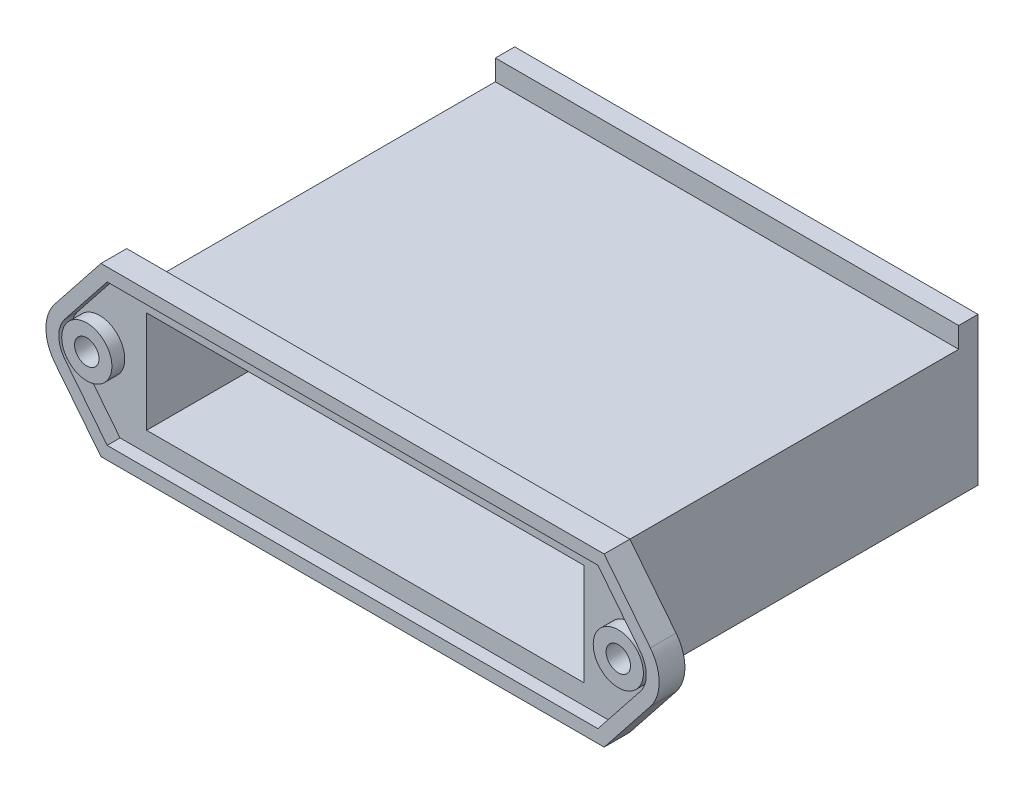
ISO-10303-21;
HEADER;
FILE_DESCRIPTION(('STEP AP214'),'2;1');
FILE_NAME('part.step','',(''),(''),'','','');
FILE_SCHEMA(('AUTOMOTIVE_DESIGN { 1 0 10303 214 1 1 1 1 }'));
ENDSEC;
DATA;
#1=APPLICATION_CONTEXT('core data for automotive mechanical design processes');
#2=APPLICATION_PROTOCOL_DEFINITION('international standard','automotive_design',2000,#1);
#3=PRODUCT_CONTEXT('',#1,'mechanical');
#4=PRODUCT('Part','Part','',(#3));
#5=PRODUCT_RELATED_PRODUCT_CATEGORY('part','',(#4));
#6=PRODUCT_DEFINITION_FORMATION('','',#4);
#7=PRODUCT_DEFINITION_CONTEXT('part definition',#1,'design');
#8=PRODUCT_DEFINITION('design','',#6,#7);
#9=PRODUCT_DEFINITION_SHAPE('','',#8);
#10=(LENGTH_UNIT() NAMED_UNIT(*) SI_UNIT(.MILLI.,.METRE.));
#11=(NAMED_UNIT(*) PLANE_ANGLE_UNIT() SI_UNIT($,.RADIAN.));
#12=(NAMED_UNIT(*) SI_UNIT($,.STERADIAN.) SOLID_ANGLE_UNIT());
#13=UNCERTAINTY_MEASURE_WITH_UNIT(LENGTH_MEASURE(1.E-05),#10,'distance_accuracy_value','');
#14=(GEOMETRIC_REPRESENTATION_CONTEXT(3) GLOBAL_UNCERTAINTY_ASSIGNED_CONTEXT((#13)) GLOBAL_UNIT_ASSIGNED_CONTEXT((#10,
#11,#12)) REPRESENTATION_CONTEXT('',''));
#15=CARTESIAN_POINT('',(0.,0.,0.));
#16=DIRECTION('',(0.,0.,1.));
#17=DIRECTION('',(1.,0.,0.));
#18=AXIS2_PLACEMENT_3D('',#15,#16,#17);
#19=CARTESIAN_POINT('',(41.3,0.,32.6));
#20=DIRECTION('',(0.,0.,-1.));
#21=DIRECTION('',(-1.,0.,0.));
#22=AXIS2_PLACEMENT_3D('',#19,#20,#21);
#23=PLANE('',#22);
#24=CARTESIAN_POINT('',(-41.3,0.,32.6));
#25=DIRECTION('',(0.,0.,1.));
#26=DIRECTION('',(1.,0.,0.));
#27=AXIS2_PLACEMENT_3D('',#24,#25,#26);
#28=CIRCLE('',#27,1.9);
#29=CARTESIAN_POINT('',(-39.4,0.,32.6));
#30=VERTEX_POINT('',#29);
#31=EDGE_CURVE('E335',#30,#30,#28,.T.);
#32=ORIENTED_EDGE('',*,*,#31,.F.);
#33=EDGE_LOOP('',(#32));
#34=FACE_BOUND('',#33,.T.);
#35=CARTESIAN_POINT('',(-41.3,0.,32.6));
#36=DIRECTION('',(0.,0.,-1.));
#37=DIRECTION('',(-1.,0.,0.));
#38=AXIS2_PLACEMENT_3D('',#35,#36,#37);
#39=CIRCLE('',#38,3.9);
#40=CARTESIAN_POINT('',(-45.2,0.,32.6));
#41=VERTEX_POINT('',#40);
#42=EDGE_CURVE('E244',#41,#41,#39,.F.);
#43=ORIENTED_EDGE('',*,*,#42,.T.);
#44=EDGE_LOOP('',(#43));
#45=FACE_BOUND('',#44,.T.);
#46=ADVANCED_FACE('F33',(#34,#45),#23,.F.);
#47=CARTESIAN_POINT('',(41.3,0.,32.6));
#48=DIRECTION('',(0.,0.,1.));
#49=DIRECTION('',(1.,0.,0.));
#50=AXIS2_PLACEMENT_3D('',#47,#48,#49);
#51=CIRCLE('',#50,1.9);
#52=CARTESIAN_POINT('',(43.2,0.,32.6));
#53=VERTEX_POINT('',#52);
#54=EDGE_CURVE('E329',#53,#53,#51,.T.);
#55=ORIENTED_EDGE('',*,*,#54,.F.);
#56=EDGE_LOOP('',(#55));
#57=FACE_BOUND('',#56,.T.);
#58=CARTESIAN_POINT('',(41.3,0.,32.6));
#59=DIRECTION('',(0.,0.,-1.));
#60=DIRECTION('',(-1.,0.,0.));
#61=AXIS2_PLACEMENT_3D('',#58,#59,#60);
#62=CIRCLE('',#61,3.9);
#63=CARTESIAN_POINT('',(37.4,0.,32.6));
#64=VERTEX_POINT('',#63);
#65=EDGE_CURVE('E245',#64,#64,#62,.F.);
#66=ORIENTED_EDGE('',*,*,#65,.T.);
#67=EDGE_LOOP('',(#66));
#68=FACE_BOUND('',#67,.T.);
#69=ADVANCED_FACE('F456',(#57,#68),#23,.F.);
#70=CARTESIAN_POINT('',(-36.,9.9,-28.6));
#71=DIRECTION('',(1.,0.,0.));
#72=DIRECTION('',(0.,0.,-1.));
#73=AXIS2_PLACEMENT_3D('',#70,#71,#72);
#74=PLANE('',#73);
#75=DIRECTION('',(0.,0.,1.));
#76=VECTOR('',#75,1.);
#77=CARTESIAN_POINT('',(-36.,9.9,-28.6));
#78=LINE('',#77,#76);
#79=CARTESIAN_POINT('',(-36.,9.9,-25.6));
#80=VERTEX_POINT('',#79);
#81=CARTESIAN_POINT('',(-36.,9.9,28.6));
#82=VERTEX_POINT('',#81);
#83=EDGE_CURVE('E399',#80,#82,#78,.T.);
#84=ORIENTED_EDGE('',*,*,#83,.F.);
#85=DIRECTION('',(0.,1.,0.));
#86=VECTOR('',#85,1.);
#87=CARTESIAN_POINT('',(-36.,-9.9,-25.6));
#88=LINE('',#87,#86);
#89=CARTESIAN_POINT('',(-36.,13.1,-25.6));
#90=VERTEX_POINT('',#89);
#91=EDGE_CURVE('E313',#80,#90,#88,.T.);
#92=ORIENTED_EDGE('',*,*,#91,.T.);
#93=DIRECTION('',(0.,0.,-1.));
#94=VECTOR('',#93,1.);
#95=CARTESIAN_POINT('',(-36.,13.1,-25.6));
#96=LINE('',#95,#94);
#97=CARTESIAN_POINT('',(-36.,13.1,-28.6));
#98=VERTEX_POINT('',#97);
#99=EDGE_CURVE('E318',#90,#98,#96,.T.);
#100=ORIENTED_EDGE('',*,*,#99,.T.);
#101=DIRECTION('',(0.,-1.,0.));
#102=VECTOR('',#101,1.);
#103=CARTESIAN_POINT('',(-36.,9.9,-28.6));
#104=LINE('',#103,#102);
#105=CARTESIAN_POINT('',(-36.,-9.9,-28.6));
#106=VERTEX_POINT('',#105);
#107=EDGE_CURVE('E405',#98,#106,#104,.T.);
#108=ORIENTED_EDGE('',*,*,#107,.T.);
#109=DIRECTION('',(0.,0.,1.));
#110=VECTOR('',#109,1.);
#111=CARTESIAN_POINT('',(-36.,-9.9,-28.6));
#112=LINE('',#111,#110);
#113=CARTESIAN_POINT('',(-36.,-9.9,28.6));
#114=VERTEX_POINT('',#113);
#115=EDGE_CURVE('E398',#106,#114,#112,.T.);
#116=ORIENTED_EDGE('',*,*,#115,.T.);
#117=DIRECTION('',(0.,-1.,0.));
#118=VECTOR('',#117,1.);
#119=CARTESIAN_POINT('',(-36.,9.9,28.6));
#120=LINE('',#119,#118);
#121=EDGE_CURVE('E11',#82,#114,#120,.T.);
#122=ORIENTED_EDGE('',*,*,#121,.F.);
#123=EDGE_LOOP('',(#84,#92,#100,#108,#116,#122));
#124=FACE_BOUND('',#123,.T.);
#125=ADVANCED_FACE('F35',(#124),#74,.F.);
#126=CARTESIAN_POINT('',(36.,9.9,-28.6));
#127=DIRECTION('',(-1.,0.,0.));
#128=DIRECTION('',(0.,0.,1.));
#129=AXIS2_PLACEMENT_3D('',#126,#127,#128);
#130=PLANE('',#129);
#131=DIRECTION('',(0.,0.,-1.));
#132=VECTOR('',#131,1.);
#133=CARTESIAN_POINT('',(36.,-9.9,-28.6));
#134=LINE('',#133,#132);
#135=CARTESIAN_POINT('',(36.,-9.9,28.6));
#136=VERTEX_POINT('',#135);
#137=CARTESIAN_POINT('',(36.,-9.9,-28.6));
#138=VERTEX_POINT('',#137);
#139=EDGE_CURVE('E410',#136,#138,#134,.T.);
#140=ORIENTED_EDGE('',*,*,#139,.T.);
#141=DIRECTION('',(0.,-1.,0.));
#142=VECTOR('',#141,1.);
#143=CARTESIAN_POINT('',(36.,9.9,-28.6));
#144=LINE('',#143,#142);
#145=CARTESIAN_POINT('',(36.,13.1,-28.6));
#146=VERTEX_POINT('',#145);
#147=EDGE_CURVE('E415',#146,#138,#144,.T.);
#148=ORIENTED_EDGE('',*,*,#147,.F.);
#149=DIRECTION('',(0.,0.,-1.));
#150=VECTOR('',#149,1.);
#151=CARTESIAN_POINT('',(36.,13.1,-25.6));
#152=LINE('',#151,#150);
#153=CARTESIAN_POINT('',(36.,13.1,-25.6));
#154=VERTEX_POINT('',#153);
#155=EDGE_CURVE('E321',#154,#146,#152,.T.);
#156=ORIENTED_EDGE('',*,*,#155,.F.);
#157=DIRECTION('',(0.,-1.,0.));
#158=VECTOR('',#157,1.);
#159=CARTESIAN_POINT('',(36.,-9.9,-25.6));
#160=LINE('',#159,#158);
#161=CARTESIAN_POINT('',(36.,9.9,-25.6));
#162=VERTEX_POINT('',#161);
#163=EDGE_CURVE('E310',#154,#162,#160,.T.);
#164=ORIENTED_EDGE('',*,*,#163,.T.);
#165=DIRECTION('',(0.,0.,-1.));
#166=VECTOR('',#165,1.);
#167=CARTESIAN_POINT('',(36.,9.9,-28.6));
#168=LINE('',#167,#166);
#169=CARTESIAN_POINT('',(36.,9.9,28.6));
#170=VERTEX_POINT('',#169);
#171=EDGE_CURVE('E56',#170,#162,#168,.T.);
#172=ORIENTED_EDGE('',*,*,#171,.F.);
#173=DIRECTION('',(0.,-1.,0.));
#174=VECTOR('',#173,1.);
#175=CARTESIAN_POINT('',(36.,9.9,28.6));
#176=LINE('',#175,#174);
#177=EDGE_CURVE('E41',#170,#136,#176,.T.);
#178=ORIENTED_EDGE('',*,*,#177,.T.);
#179=EDGE_LOOP('',(#140,#148,#156,#164,#172,#178));
#180=FACE_BOUND('',#179,.T.);
#181=ADVANCED_FACE('F420',(#180),#130,.F.);
#182=CARTESIAN_POINT('',(-36.,9.9,-28.6));
#183=DIRECTION('',(0.,0.,1.));
#184=DIRECTION('',(1.,0.,0.));
#185=AXIS2_PLACEMENT_3D('',#182,#183,#184);
#186=PLANE('',#185);
#187=DIRECTION('',(-1.,0.,0.));
#188=VECTOR('',#187,1.);
#189=CARTESIAN_POINT('',(-36.,-9.9,-28.6));
#190=LINE('',#189,#188);
#191=EDGE_CURVE('E402',#138,#106,#190,.T.);
#192=ORIENTED_EDGE('',*,*,#191,.T.);
#193=ORIENTED_EDGE('',*,*,#107,.F.);
#194=DIRECTION('',(1.,0.,0.));
#195=VECTOR('',#194,1.);
#196=CARTESIAN_POINT('',(36.,13.1,-28.6));
#197=LINE('',#196,#195);
#198=EDGE_CURVE('E309',#98,#146,#197,.T.);
#199=ORIENTED_EDGE('',*,*,#198,.T.);
#200=ORIENTED_EDGE('',*,*,#147,.T.);
#201=EDGE_LOOP('',(#192,#193,#199,#200));
#202=FACE_BOUND('',#201,.T.);
#203=ADVANCED_FACE('F432',(#202),#186,.F.);
#204=CARTESIAN_POINT('',(0.,9.9,0.));
#205=DIRECTION('',(0.,1.,0.));
#206=DIRECTION('',(0.,0.,1.));
#207=AXIS2_PLACEMENT_3D('',#204,#205,#206);
#208=PLANE('',#207);
#209=DIRECTION('',(1.,0.,0.));
#210=VECTOR('',#209,1.);
#211=CARTESIAN_POINT('',(0.,9.9,-25.6));
#212=LINE('',#211,#210);
#213=EDGE_CURVE('E324',#80,#162,#212,.T.);
#214=ORIENTED_EDGE('',*,*,#213,.F.);
#215=ORIENTED_EDGE('',*,*,#83,.T.);
#216=DIRECTION('',(1.,0.,0.));
#217=VECTOR('',#216,1.);
#218=CARTESIAN_POINT('',(-36.,9.9,28.6));
#219=LINE('',#218,#217);
#220=EDGE_CURVE('E401',#82,#170,#219,.T.);
#221=ORIENTED_EDGE('',*,*,#220,.T.);
#222=ORIENTED_EDGE('',*,*,#171,.T.);
#223=EDGE_LOOP('',(#214,#215,#221,#222));
#224=FACE_BOUND('',#223,.T.);
#225=ADVANCED_FACE('F444',(#224),#208,.T.);
#226=CARTESIAN_POINT('',(0.,-9.9,0.));
#227=DIRECTION('',(0.,1.,0.));
#228=DIRECTION('',(0.,0.,1.));
#229=AXIS2_PLACEMENT_3D('',#226,#227,#228);
#230=PLANE('',#229);
#231=DIRECTION('',(1.,0.,0.));
#232=VECTOR('',#231,1.);
#233=CARTESIAN_POINT('',(-36.,-9.9,28.6));
#234=LINE('',#233,#232);
#235=EDGE_CURVE('E407',#114,#136,#234,.T.);
#236=ORIENTED_EDGE('',*,*,#235,.F.);
#237=ORIENTED_EDGE('',*,*,#115,.F.);
#238=ORIENTED_EDGE('',*,*,#191,.F.);
#239=ORIENTED_EDGE('',*,*,#139,.F.);
#240=EDGE_LOOP('',(#236,#237,#238,#239));
#241=FACE_BOUND('',#240,.T.);
#242=ADVANCED_FACE('F429',(#241),#230,.F.);
#243=DIRECTION('',(-0.621093822029376,-0.783736221082669,0.));
#244=VECTOR('',#243,1.);
#245=CARTESIAN_POINT('',(-12.8456801076811,42.9092678120746,32.6));
#246=LINE('',#245,#244);
#247=CARTESIAN_POINT('',(-38.1330772834585,11.,32.6));
#248=VERTEX_POINT('',#247);
#249=CARTESIAN_POINT('',(-44.7092525617096,2.70175812582778,32.6));
#250=VERTEX_POINT('',#249);
#251=EDGE_CURVE('E252',#248,#250,#246,.T.);
#252=ORIENTED_EDGE('',*,*,#251,.F.);
#253=DIRECTION('',(-1.,0.,0.));
#254=VECTOR('',#253,1.);
#255=CARTESIAN_POINT('',(41.3,11.,32.6));
#256=LINE('',#255,#254);
#257=CARTESIAN_POINT('',(38.1330772834585,11.,32.6));
#258=VERTEX_POINT('',#257);
#259=EDGE_CURVE('E274',#258,#248,#256,.T.);
#260=ORIENTED_EDGE('',*,*,#259,.F.);
#261=DIRECTION('',(-0.621093822029374,0.78373622108267,0.));
#262=VECTOR('',#261,1.);
#263=CARTESIAN_POINT('',(44.7092525617096,2.70175812582778,32.6));
#264=LINE('',#263,#262);
#265=CARTESIAN_POINT('',(44.7092525617096,2.70175812582778,32.6));
#266=VERTEX_POINT('',#265);
#267=EDGE_CURVE('E301',#266,#258,#264,.T.);
#268=ORIENTED_EDGE('',*,*,#267,.F.);
#269=CARTESIAN_POINT('',(41.3,0.,32.6));
#270=DIRECTION('',(0.,0.,-1.));
#271=DIRECTION('',(-1.,0.,0.));
#272=AXIS2_PLACEMENT_3D('',#269,#270,#271);
#273=CIRCLE('',#272,4.34999999999999);
#274=CARTESIAN_POINT('',(44.7092525617096,-2.70175812582777,32.6));
#275=VERTEX_POINT('',#274);
#276=EDGE_CURVE('E299',#275,#266,#273,.F.);
#277=ORIENTED_EDGE('',*,*,#276,.F.);
#278=DIRECTION('',(0.621093822029374,0.78373622108267,0.));
#279=VECTOR('',#278,1.);
#280=CARTESIAN_POINT('',(44.7092525617096,-2.70175812582777,32.6));
#281=LINE('',#280,#279);
#282=CARTESIAN_POINT('',(38.1330772834585,-11.,32.6));
#283=VERTEX_POINT('',#282);
#284=EDGE_CURVE('E297',#283,#275,#281,.T.);
#285=ORIENTED_EDGE('',*,*,#284,.F.);
#286=DIRECTION('',(1.,0.,0.));
#287=VECTOR('',#286,1.);
#288=CARTESIAN_POINT('',(41.3,-11.,32.6));
#289=LINE('',#288,#287);
#290=CARTESIAN_POINT('',(-38.1330772834585,-11.,32.6));
#291=VERTEX_POINT('',#290);
#292=EDGE_CURVE('E295',#291,#283,#289,.T.);
#293=ORIENTED_EDGE('',*,*,#292,.F.);
#294=DIRECTION('',(0.621093822029376,-0.783736221082669,0.));
#295=VECTOR('',#294,1.);
#296=CARTESIAN_POINT('',(-12.845680107681,-42.9092678120746,32.6));
#297=LINE('',#296,#295);
#298=CARTESIAN_POINT('',(-44.7092525617096,-2.70175812582779,32.6));
#299=VERTEX_POINT('',#298);
#300=EDGE_CURVE('E293',#299,#291,#297,.T.);
#301=ORIENTED_EDGE('',*,*,#300,.F.);
#302=CARTESIAN_POINT('',(-41.3,0.,32.6));
#303=DIRECTION('',(0.,0.,-1.));
#304=DIRECTION('',(-1.,0.,0.));
#305=AXIS2_PLACEMENT_3D('',#302,#303,#304);
#306=CIRCLE('',#305,4.35);
#307=EDGE_CURVE('E291',#250,#299,#306,.F.);
#308=ORIENTED_EDGE('',*,*,#307,.F.);
#309=EDGE_LOOP('',(#252,#260,#268,#277,#285,#293,#301,#308));
#310=FACE_BOUND('',#309,.T.);
#311=DIRECTION('',(-0.621093822029375,-0.783736221082669,0.));
#312=VECTOR('',#311,1.);
#313=CARTESIAN_POINT('',(-46.2767250038749,3.94394576988654,32.6));
#314=LINE('',#313,#312);
#315=CARTESIAN_POINT('',(-39.1,13.,32.6));
#316=VERTEX_POINT('',#315);
#317=CARTESIAN_POINT('',(-46.2767250038749,3.94394576988654,32.6));
#318=VERTEX_POINT('',#317);
#319=EDGE_CURVE('E341',#316,#318,#314,.T.);
#320=ORIENTED_EDGE('',*,*,#319,.T.);
#321=CARTESIAN_POINT('',(-41.3,0.,32.6));
#322=DIRECTION('',(0.,0.,1.));
#323=DIRECTION('',(-1.,0.,0.));
#324=AXIS2_PLACEMENT_3D('',#321,#322,#323);
#325=CIRCLE('',#324,6.35);
#326=CARTESIAN_POINT('',(-46.2767250038749,-3.94394576988654,32.6));
#327=VERTEX_POINT('',#326);
#328=EDGE_CURVE('E344',#318,#327,#325,.T.);
#329=ORIENTED_EDGE('',*,*,#328,.T.);
#330=DIRECTION('',(0.621093822029376,-0.783736221082669,0.));
#331=VECTOR('',#330,1.);
#332=CARTESIAN_POINT('',(-46.2767250038749,-3.94394576988654,32.6));
#333=LINE('',#332,#331);
#334=CARTESIAN_POINT('',(-39.1,-13.,32.6));
#335=VERTEX_POINT('',#334);
#336=EDGE_CURVE('E347',#327,#335,#333,.T.);
#337=ORIENTED_EDGE('',*,*,#336,.T.);
#338=DIRECTION('',(1.,0.,0.));
#339=VECTOR('',#338,1.);
#340=CARTESIAN_POINT('',(-39.1,-13.,32.6));
#341=LINE('',#340,#339);
#342=CARTESIAN_POINT('',(39.1,-13.,32.6));
#343=VERTEX_POINT('',#342);
#344=EDGE_CURVE('E349',#335,#343,#341,.T.);
#345=ORIENTED_EDGE('',*,*,#344,.T.);
#346=DIRECTION('',(0.621093822029374,0.78373622108267,0.));
#347=VECTOR('',#346,1.);
#348=CARTESIAN_POINT('',(46.2767250038749,-3.94394576988652,32.6));
#349=LINE('',#348,#347);
#350=CARTESIAN_POINT('',(46.2767250038749,-3.94394576988652,32.6));
#351=VERTEX_POINT('',#350);
#352=EDGE_CURVE('E351',#343,#351,#349,.T.);
#353=ORIENTED_EDGE('',*,*,#352,.T.);
#354=CARTESIAN_POINT('',(41.3,0.,32.6));
#355=DIRECTION('',(0.,0.,1.));
#356=DIRECTION('',(-1.,0.,0.));
#357=AXIS2_PLACEMENT_3D('',#354,#355,#356);
#358=CIRCLE('',#357,6.34999999999999);
#359=CARTESIAN_POINT('',(46.2767250038749,3.94394576988654,32.6));
#360=VERTEX_POINT('',#359);
#361=EDGE_CURVE('E353',#351,#360,#358,.T.);
#362=ORIENTED_EDGE('',*,*,#361,.T.);
#363=DIRECTION('',(-0.621093822029374,0.78373622108267,0.));
#364=VECTOR('',#363,1.);
#365=CARTESIAN_POINT('',(39.1,13.,32.6));
#366=LINE('',#365,#364);
#367=CARTESIAN_POINT('',(39.1,13.,32.6));
#368=VERTEX_POINT('',#367);
#369=EDGE_CURVE('E355',#360,#368,#366,.T.);
#370=ORIENTED_EDGE('',*,*,#369,.T.);
#371=DIRECTION('',(-1.,0.,0.));
#372=VECTOR('',#371,1.);
#373=CARTESIAN_POINT('',(-39.1,13.,32.6));
#374=LINE('',#373,#372);
#375=EDGE_CURVE('E357',#368,#316,#374,.T.);
#376=ORIENTED_EDGE('',*,*,#375,.T.);
#377=EDGE_LOOP('',(#320,#329,#337,#345,#353,#362,#370,#376));
#378=FACE_BOUND('',#377,.T.);
#379=ADVANCED_FACE('F451',(#310,#378),#23,.F.);
#380=CARTESIAN_POINT('',(41.3,0.,28.6));
#381=DIRECTION('',(0.,0.,-1.));
#382=DIRECTION('',(-1.,0.,0.));
#383=AXIS2_PLACEMENT_3D('',#380,#381,#382);
#384=PLANE('',#383);
#385=ORIENTED_EDGE('',*,*,#177,.F.);
#386=ORIENTED_EDGE('',*,*,#220,.F.);
#387=ORIENTED_EDGE('',*,*,#121,.T.);
#388=ORIENTED_EDGE('',*,*,#235,.T.);
#389=EDGE_LOOP('',(#385,#386,#387,#388));
#390=FACE_BOUND('',#389,.T.);
#391=CARTESIAN_POINT('',(-41.3,0.,28.6));
#392=DIRECTION('',(0.,0.,1.));
#393=DIRECTION('',(1.,0.,0.));
#394=AXIS2_PLACEMENT_3D('',#391,#392,#393);
#395=CIRCLE('',#394,1.9);
#396=CARTESIAN_POINT('',(-39.4,0.,28.6));
#397=VERTEX_POINT('',#396);
#398=EDGE_CURVE('E332',#397,#397,#395,.T.);
#399=ORIENTED_EDGE('',*,*,#398,.T.);
#400=EDGE_LOOP('',(#399));
#401=FACE_BOUND('',#400,.T.);
#402=DIRECTION('',(-0.621093822029375,-0.783736221082669,0.));
#403=VECTOR('',#402,1.);
#404=CARTESIAN_POINT('',(-46.2767250038749,3.94394576988654,28.6));
#405=LINE('',#404,#403);
#406=CARTESIAN_POINT('',(-39.1,13.,28.6));
#407=VERTEX_POINT('',#406);
#408=CARTESIAN_POINT('',(-46.2767250038749,3.94394576988654,28.6));
#409=VERTEX_POINT('',#408);
#410=EDGE_CURVE('E338',#407,#409,#405,.T.);
#411=ORIENTED_EDGE('',*,*,#410,.F.);
#412=DIRECTION('',(-1.,0.,0.));
#413=VECTOR('',#412,1.);
#414=CARTESIAN_POINT('',(-39.1,13.,28.6));
#415=LINE('',#414,#413);
#416=CARTESIAN_POINT('',(39.1,13.,28.6));
#417=VERTEX_POINT('',#416);
#418=EDGE_CURVE('E345',#417,#407,#415,.T.);
#419=ORIENTED_EDGE('',*,*,#418,.F.);
#420=DIRECTION('',(-0.621093822029374,0.78373622108267,0.));
#421=VECTOR('',#420,1.);
#422=CARTESIAN_POINT('',(39.1,13.,28.6));
#423=LINE('',#422,#421);
#424=CARTESIAN_POINT('',(46.2767250038749,3.94394576988654,28.6));
#425=VERTEX_POINT('',#424);
#426=EDGE_CURVE('E372',#425,#417,#423,.T.);
#427=ORIENTED_EDGE('',*,*,#426,.F.);
#428=CARTESIAN_POINT('',(41.3,0.,28.6));
#429=DIRECTION('',(0.,0.,1.));
#430=DIRECTION('',(-1.,0.,0.));
#431=AXIS2_PLACEMENT_3D('',#428,#429,#430);
#432=CIRCLE('',#431,6.34999999999999);
#433=CARTESIAN_POINT('',(46.2767250038749,-3.94394576988652,28.6));
#434=VERTEX_POINT('',#433);
#435=EDGE_CURVE('E370',#434,#425,#432,.T.);
#436=ORIENTED_EDGE('',*,*,#435,.F.);
#437=DIRECTION('',(0.621093822029374,0.78373622108267,0.));
#438=VECTOR('',#437,1.);
#439=CARTESIAN_POINT('',(46.2767250038749,-3.94394576988652,28.6));
#440=LINE('',#439,#438);
#441=CARTESIAN_POINT('',(39.1,-13.,28.6));
#442=VERTEX_POINT('',#441);
#443=EDGE_CURVE('E368',#442,#434,#440,.T.);
#444=ORIENTED_EDGE('',*,*,#443,.F.);
#445=DIRECTION('',(1.,0.,0.));
#446=VECTOR('',#445,1.);
#447=CARTESIAN_POINT('',(-39.1,-13.,28.6));
#448=LINE('',#447,#446);
#449=CARTESIAN_POINT('',(-39.1,-13.,28.6));
#450=VERTEX_POINT('',#449);
#451=EDGE_CURVE('E366',#450,#442,#448,.T.);
#452=ORIENTED_EDGE('',*,*,#451,.F.);
#453=DIRECTION('',(0.621093822029376,-0.783736221082669,0.));
#454=VECTOR('',#453,1.);
#455=CARTESIAN_POINT('',(-46.2767250038749,-3.94394576988654,28.6));
#456=LINE('',#455,#454);
#457=CARTESIAN_POINT('',(-46.2767250038749,-3.94394576988654,28.6));
#458=VERTEX_POINT('',#457);
#459=EDGE_CURVE('E364',#458,#450,#456,.T.);
#460=ORIENTED_EDGE('',*,*,#459,.F.);
#461=CARTESIAN_POINT('',(-41.3,0.,28.6));
#462=DIRECTION('',(0.,0.,1.));
#463=DIRECTION('',(-1.,0.,0.));
#464=AXIS2_PLACEMENT_3D('',#461,#462,#463);
#465=CIRCLE('',#464,6.35);
#466=EDGE_CURVE('E362',#409,#458,#465,.T.);
#467=ORIENTED_EDGE('',*,*,#466,.F.);
#468=EDGE_LOOP('',(#411,#419,#427,#436,#444,#452,#460,#467));
#469=FACE_BOUND('',#468,.T.);
#470=CARTESIAN_POINT('',(41.3,0.,28.6));
#471=DIRECTION('',(0.,0.,1.));
#472=DIRECTION('',(1.,0.,0.));
#473=AXIS2_PLACEMENT_3D('',#470,#471,#472);
#474=CIRCLE('',#473,1.9);
#475=CARTESIAN_POINT('',(43.2,0.,28.6));
#476=VERTEX_POINT('',#475);
#477=EDGE_CURVE('E328',#476,#476,#474,.T.);
#478=ORIENTED_EDGE('',*,*,#477,.T.);
#479=EDGE_LOOP('',(#478));
#480=FACE_BOUND('',#479,.T.);
#481=ADVANCED_FACE('F424',(#390,#401,#469,#480),#384,.T.);
#482=CARTESIAN_POINT('',(-46.2767250038749,3.94394576988654,32.6));
#483=DIRECTION('',(0.783736221082669,-0.621093822029376,0.));
#484=DIRECTION('',(0.621093822029376,0.783736221082669,0.));
#485=AXIS2_PLACEMENT_3D('',#482,#483,#484);
#486=PLANE('',#485);
#487=ORIENTED_EDGE('',*,*,#410,.T.);
#488=DIRECTION('',(0.,0.,-1.));
#489=VECTOR('',#488,1.);
#490=CARTESIAN_POINT('',(-46.2767250038749,3.94394576988654,32.6));
#491=LINE('',#490,#489);
#492=EDGE_CURVE('E395',#318,#409,#491,.T.);
#493=ORIENTED_EDGE('',*,*,#492,.F.);
#494=ORIENTED_EDGE('',*,*,#319,.F.);
#495=DIRECTION('',(0.,0.,-1.));
#496=VECTOR('',#495,1.);
#497=CARTESIAN_POINT('',(-39.1,13.,32.6));
#498=LINE('',#497,#496);
#499=EDGE_CURVE('E359',#316,#407,#498,.T.);
#500=ORIENTED_EDGE('',*,*,#499,.T.);
#501=EDGE_LOOP('',(#487,#493,#494,#500));
#502=FACE_BOUND('',#501,.T.);
#503=ADVANCED_FACE('F472',(#502),#486,.F.);
#504=CARTESIAN_POINT('',(-41.3,0.,32.6));
#505=DIRECTION('',(0.,0.,-1.));
#506=DIRECTION('',(-1.,0.,0.));
#507=AXIS2_PLACEMENT_3D('',#504,#505,#506);
#508=CYLINDRICAL_SURFACE('',#507,6.35);
#509=ORIENTED_EDGE('',*,*,#466,.T.);
#510=DIRECTION('',(0.,0.,-1.));
#511=VECTOR('',#510,1.);
#512=CARTESIAN_POINT('',(-46.2767250038749,-3.94394576988654,32.6));
#513=LINE('',#512,#511);
#514=EDGE_CURVE('E392',#327,#458,#513,.T.);
#515=ORIENTED_EDGE('',*,*,#514,.F.);
#516=ORIENTED_EDGE('',*,*,#328,.F.);
#517=ORIENTED_EDGE('',*,*,#492,.T.);
#518=EDGE_LOOP('',(#509,#515,#516,#517));
#519=FACE_BOUND('',#518,.T.);
#520=ADVANCED_FACE('F485',(#519),#508,.T.);
#521=CARTESIAN_POINT('',(-46.2767250038749,-3.94394576988654,32.6));
#522=DIRECTION('',(0.783736221082669,0.621093822029376,0.));
#523=DIRECTION('',(-0.621093822029376,0.783736221082669,0.));
#524=AXIS2_PLACEMENT_3D('',#521,#522,#523);
#525=PLANE('',#524);
#526=ORIENTED_EDGE('',*,*,#459,.T.);
#527=DIRECTION('',(0.,0.,-1.));
#528=VECTOR('',#527,1.);
#529=CARTESIAN_POINT('',(-39.1,-13.,32.6));
#530=LINE('',#529,#528);
#531=EDGE_CURVE('E389',#335,#450,#530,.T.);
#532=ORIENTED_EDGE('',*,*,#531,.F.);
#533=ORIENTED_EDGE('',*,*,#336,.F.);
#534=ORIENTED_EDGE('',*,*,#514,.T.);
#535=EDGE_LOOP('',(#526,#532,#533,#534));
#536=FACE_BOUND('',#535,.T.);
#537=ADVANCED_FACE('F490',(#536),#525,.F.);
#538=CARTESIAN_POINT('',(-39.1,-13.,32.6));
#539=DIRECTION('',(0.,1.,0.));
#540=DIRECTION('',(-1.,0.,0.));
#541=AXIS2_PLACEMENT_3D('',#538,#539,#540);
#542=PLANE('',#541);
#543=ORIENTED_EDGE('',*,*,#451,.T.);
#544=DIRECTION('',(0.,0.,-1.));
#545=VECTOR('',#544,1.);
#546=CARTESIAN_POINT('',(39.1,-13.,32.6));
#547=LINE('',#546,#545);
#548=EDGE_CURVE('E386',#343,#442,#547,.T.);
#549=ORIENTED_EDGE('',*,*,#548,.F.);
#550=ORIENTED_EDGE('',*,*,#344,.F.);
#551=ORIENTED_EDGE('',*,*,#531,.T.);
#552=EDGE_LOOP('',(#543,#549,#550,#551));
#553=FACE_BOUND('',#552,.T.);
#554=ADVANCED_FACE('F496',(#553),#542,.F.);
#555=CARTESIAN_POINT('',(46.2767250038749,-3.94394576988652,32.6));
#556=DIRECTION('',(-0.78373622108267,0.621093822029374,0.));
#557=DIRECTION('',(-0.621093822029374,-0.78373622108267,0.));
#558=AXIS2_PLACEMENT_3D('',#555,#556,#557);
#559=PLANE('',#558);
#560=ORIENTED_EDGE('',*,*,#443,.T.);
#561=DIRECTION('',(0.,0.,-1.));
#562=VECTOR('',#561,1.);
#563=CARTESIAN_POINT('',(46.2767250038749,-3.94394576988652,32.6));
#564=LINE('',#563,#562);
#565=EDGE_CURVE('E383',#351,#434,#564,.T.);
#566=ORIENTED_EDGE('',*,*,#565,.F.);
#567=ORIENTED_EDGE('',*,*,#352,.F.);
#568=ORIENTED_EDGE('',*,*,#548,.T.);
#569=EDGE_LOOP('',(#560,#566,#567,#568));
#570=FACE_BOUND('',#569,.T.);
#571=ADVANCED_FACE('F500',(#570),#559,.F.);
#572=CARTESIAN_POINT('',(41.3,0.,32.6));
#573=DIRECTION('',(0.,0.,-1.));
#574=DIRECTION('',(-1.,0.,0.));
#575=AXIS2_PLACEMENT_3D('',#572,#573,#574);
#576=CYLINDRICAL_SURFACE('',#575,6.34999999999999);
#577=ORIENTED_EDGE('',*,*,#435,.T.);
#578=DIRECTION('',(0.,0.,-1.));
#579=VECTOR('',#578,1.);
#580=CARTESIAN_POINT('',(46.2767250038749,3.94394576988654,32.6));
#581=LINE('',#580,#579);
#582=EDGE_CURVE('E380',#360,#425,#581,.T.);
#583=ORIENTED_EDGE('',*,*,#582,.F.);
#584=ORIENTED_EDGE('',*,*,#361,.F.);
#585=ORIENTED_EDGE('',*,*,#565,.T.);
#586=EDGE_LOOP('',(#577,#583,#584,#585));
#587=FACE_BOUND('',#586,.T.);
#588=ADVANCED_FACE('F505',(#587),#576,.T.);
#589=CARTESIAN_POINT('',(39.1,13.,32.6));
#590=DIRECTION('',(-0.78373622108267,-0.621093822029374,0.));
#591=DIRECTION('',(0.621093822029374,-0.78373622108267,0.));
#592=AXIS2_PLACEMENT_3D('',#589,#590,#591);
#593=PLANE('',#592);
#594=ORIENTED_EDGE('',*,*,#426,.T.);
#595=DIRECTION('',(0.,0.,-1.));
#596=VECTOR('',#595,1.);
#597=CARTESIAN_POINT('',(39.1,13.,32.6));
#598=LINE('',#597,#596);
#599=EDGE_CURVE('E377',#368,#417,#598,.T.);
#600=ORIENTED_EDGE('',*,*,#599,.F.);
#601=ORIENTED_EDGE('',*,*,#369,.F.);
#602=ORIENTED_EDGE('',*,*,#582,.T.);
#603=EDGE_LOOP('',(#594,#600,#601,#602));
#604=FACE_BOUND('',#603,.T.);
#605=ADVANCED_FACE('F509',(#604),#593,.F.);
#606=CARTESIAN_POINT('',(-39.1,13.,32.6));
#607=DIRECTION('',(0.,-1.,0.));
#608=DIRECTION('',(1.,0.,0.));
#609=AXIS2_PLACEMENT_3D('',#606,#607,#608);
#610=PLANE('',#609);
#611=ORIENTED_EDGE('',*,*,#418,.T.);
#612=ORIENTED_EDGE('',*,*,#499,.F.);
#613=ORIENTED_EDGE('',*,*,#375,.F.);
#614=ORIENTED_EDGE('',*,*,#599,.T.);
#615=EDGE_LOOP('',(#611,#612,#613,#614));
#616=FACE_BOUND('',#615,.T.);
#617=ADVANCED_FACE('F513',(#616),#610,.F.);
#618=CARTESIAN_POINT('',(-41.3,0.,32.6));
#619=DIRECTION('',(0.,0.,-1.));
#620=DIRECTION('',(-1.,0.,0.));
#621=AXIS2_PLACEMENT_3D('',#618,#619,#620);
#622=CYLINDRICAL_SURFACE('',#621,1.9);
#623=ORIENTED_EDGE('',*,*,#31,.T.);
#624=EDGE_LOOP('',(#623));
#625=FACE_BOUND('',#624,.T.);
#626=ORIENTED_EDGE('',*,*,#398,.F.);
#627=EDGE_LOOP('',(#626));
#628=FACE_BOUND('',#627,.T.);
#629=ADVANCED_FACE('F520',(#625,#628),#622,.F.);
#630=CARTESIAN_POINT('',(41.3,0.,32.6));
#631=DIRECTION('',(0.,0.,-1.));
#632=DIRECTION('',(-1.,0.,0.));
#633=AXIS2_PLACEMENT_3D('',#630,#631,#632);
#634=CYLINDRICAL_SURFACE('',#633,1.9);
#635=ORIENTED_EDGE('',*,*,#54,.T.);
#636=EDGE_LOOP('',(#635));
#637=FACE_BOUND('',#636,.T.);
#638=ORIENTED_EDGE('',*,*,#477,.F.);
#639=EDGE_LOOP('',(#638));
#640=FACE_BOUND('',#639,.T.);
#641=ADVANCED_FACE('F518',(#637,#640),#634,.F.);
#642=CARTESIAN_POINT('',(36.,13.1,-25.6));
#643=DIRECTION('',(0.,1.,0.));
#644=DIRECTION('',(-1.,0.,0.));
#645=AXIS2_PLACEMENT_3D('',#642,#643,#644);
#646=PLANE('',#645);
#647=ORIENTED_EDGE('',*,*,#198,.F.);
#648=ORIENTED_EDGE('',*,*,#99,.F.);
#649=DIRECTION('',(1.,0.,0.));
#650=VECTOR('',#649,1.);
#651=CARTESIAN_POINT('',(36.,13.1,-25.6));
#652=LINE('',#651,#650);
#653=EDGE_CURVE('E315',#90,#154,#652,.T.);
#654=ORIENTED_EDGE('',*,*,#653,.T.);
#655=ORIENTED_EDGE('',*,*,#155,.T.);
#656=EDGE_LOOP('',(#647,#648,#654,#655));
#657=FACE_BOUND('',#656,.T.);
#658=ADVANCED_FACE('F440',(#657),#646,.T.);
#659=CARTESIAN_POINT('',(0.,0.,-25.6));
#660=DIRECTION('',(0.,0.,1.));
#661=DIRECTION('',(1.,0.,0.));
#662=AXIS2_PLACEMENT_3D('',#659,#660,#661);
#663=PLANE('',#662);
#664=ORIENTED_EDGE('',*,*,#91,.F.);
#665=ORIENTED_EDGE('',*,*,#213,.T.);
#666=ORIENTED_EDGE('',*,*,#163,.F.);
#667=ORIENTED_EDGE('',*,*,#653,.F.);
#668=EDGE_LOOP('',(#664,#665,#666,#667));
#669=FACE_BOUND('',#668,.T.);
#670=ADVANCED_FACE('F443',(#669),#663,.T.);
#671=CARTESIAN_POINT('',(-34.,9.9,-28.6));
#672=DIRECTION('',(1.,0.,0.));
#673=DIRECTION('',(0.,0.,-1.));
#674=AXIS2_PLACEMENT_3D('',#671,#672,#673);
#675=PLANE('',#674);
#676=DIRECTION('',(0.,0.,1.));
#677=VECTOR('',#676,1.);
#678=CARTESIAN_POINT('',(-34.,7.9,-28.6));
#679=LINE('',#678,#677);
#680=CARTESIAN_POINT('',(-34.,7.9,-26.6));
#681=VERTEX_POINT('',#680);
#682=CARTESIAN_POINT('',(-34.,7.9,30.6));
#683=VERTEX_POINT('',#682);
#684=EDGE_CURVE('E208',#681,#683,#679,.T.);
#685=ORIENTED_EDGE('',*,*,#684,.T.);
#686=DIRECTION('',(0.,-1.,0.));
#687=VECTOR('',#686,1.);
#688=CARTESIAN_POINT('',(-34.,0.,30.6));
#689=LINE('',#688,#687);
#690=CARTESIAN_POINT('',(-34.,-7.9,30.6));
#691=VERTEX_POINT('',#690);
#692=EDGE_CURVE('E212',#683,#691,#689,.T.);
#693=ORIENTED_EDGE('',*,*,#692,.T.);
#694=DIRECTION('',(0.,0.,1.));
#695=VECTOR('',#694,1.);
#696=CARTESIAN_POINT('',(-34.,-7.9,-28.6));
#697=LINE('',#696,#695);
#698=CARTESIAN_POINT('',(-34.,-7.9,-26.6));
#699=VERTEX_POINT('',#698);
#700=EDGE_CURVE('E240',#699,#691,#697,.T.);
#701=ORIENTED_EDGE('',*,*,#700,.F.);
#702=DIRECTION('',(0.,-1.,0.));
#703=VECTOR('',#702,1.);
#704=CARTESIAN_POINT('',(-34.,9.9,-26.6));
#705=LINE('',#704,#703);
#706=EDGE_CURVE('E213',#681,#699,#705,.T.);
#707=ORIENTED_EDGE('',*,*,#706,.F.);
#708=EDGE_LOOP('',(#685,#693,#701,#707));
#709=FACE_BOUND('',#708,.T.);
#710=ADVANCED_FACE('F210',(#709),#675,.T.);
#711=CARTESIAN_POINT('',(34.,9.9,-28.6));
#712=DIRECTION('',(-1.,0.,0.));
#713=DIRECTION('',(0.,0.,1.));
#714=AXIS2_PLACEMENT_3D('',#711,#712,#713);
#715=PLANE('',#714);
#716=DIRECTION('',(0.,0.,-1.));
#717=VECTOR('',#716,1.);
#718=CARTESIAN_POINT('',(34.,-7.9,-28.6));
#719=LINE('',#718,#717);
#720=CARTESIAN_POINT('',(34.,-7.9,30.6));
#721=VERTEX_POINT('',#720);
#722=CARTESIAN_POINT('',(34.,-7.9,-26.6));
#723=VERTEX_POINT('',#722);
#724=EDGE_CURVE('E239',#721,#723,#719,.T.);
#725=ORIENTED_EDGE('',*,*,#724,.F.);
#726=DIRECTION('',(0.,-1.,0.));
#727=VECTOR('',#726,1.);
#728=CARTESIAN_POINT('',(34.,9.9,30.6));
#729=LINE('',#728,#727);
#730=CARTESIAN_POINT('',(34.,7.9,30.6));
#731=VERTEX_POINT('',#730);
#732=EDGE_CURVE('E229',#731,#721,#729,.T.);
#733=ORIENTED_EDGE('',*,*,#732,.F.);
#734=DIRECTION('',(0.,0.,-1.));
#735=VECTOR('',#734,1.);
#736=CARTESIAN_POINT('',(34.,7.9,-28.6));
#737=LINE('',#736,#735);
#738=CARTESIAN_POINT('',(34.,7.9,-26.6));
#739=VERTEX_POINT('',#738);
#740=EDGE_CURVE('E233',#731,#739,#737,.T.);
#741=ORIENTED_EDGE('',*,*,#740,.T.);
#742=DIRECTION('',(0.,-1.,0.));
#743=VECTOR('',#742,1.);
#744=CARTESIAN_POINT('',(34.,9.9,-26.6));
#745=LINE('',#744,#743);
#746=EDGE_CURVE('E839',#739,#723,#745,.T.);
#747=ORIENTED_EDGE('',*,*,#746,.T.);
#748=EDGE_LOOP('',(#725,#733,#741,#747));
#749=FACE_BOUND('',#748,.T.);
#750=ADVANCED_FACE('F582',(#749),#715,.T.);
#751=CARTESIAN_POINT('',(-36.,9.9,-26.6));
#752=DIRECTION('',(0.,0.,1.));
#753=DIRECTION('',(1.,0.,0.));
#754=AXIS2_PLACEMENT_3D('',#751,#752,#753);
#755=PLANE('',#754);
#756=ORIENTED_EDGE('',*,*,#706,.T.);
#757=DIRECTION('',(-1.,0.,0.));
#758=VECTOR('',#757,1.);
#759=CARTESIAN_POINT('',(-36.,-7.9,-26.6));
#760=LINE('',#759,#758);
#761=EDGE_CURVE('E217',#723,#699,#760,.T.);
#762=ORIENTED_EDGE('',*,*,#761,.F.);
#763=ORIENTED_EDGE('',*,*,#746,.F.);
#764=DIRECTION('',(1.,0.,0.));
#765=VECTOR('',#764,1.);
#766=CARTESIAN_POINT('',(0.,7.9,-26.6));
#767=LINE('',#766,#765);
#768=EDGE_CURVE('E228',#681,#739,#767,.T.);
#769=ORIENTED_EDGE('',*,*,#768,.F.);
#770=EDGE_LOOP('',(#756,#762,#763,#769));
#771=FACE_BOUND('',#770,.T.);
#772=ADVANCED_FACE('F579',(#771),#755,.T.);
#773=CARTESIAN_POINT('',(0.,7.9,0.));
#774=DIRECTION('',(0.,1.,0.));
#775=DIRECTION('',(0.,0.,1.));
#776=AXIS2_PLACEMENT_3D('',#773,#774,#775);
#777=PLANE('',#776);
#778=ORIENTED_EDGE('',*,*,#768,.T.);
#779=ORIENTED_EDGE('',*,*,#740,.F.);
#780=DIRECTION('',(1.,0.,0.));
#781=VECTOR('',#780,1.);
#782=CARTESIAN_POINT('',(41.3,7.9,30.6));
#783=LINE('',#782,#781);
#784=EDGE_CURVE('E216',#683,#731,#783,.T.);
#785=ORIENTED_EDGE('',*,*,#784,.F.);
#786=ORIENTED_EDGE('',*,*,#684,.F.);
#787=EDGE_LOOP('',(#778,#779,#785,#786));
#788=FACE_BOUND('',#787,.T.);
#789=ADVANCED_FACE('F231',(#788),#777,.F.);
#790=CARTESIAN_POINT('',(0.,-7.9,0.));
#791=DIRECTION('',(0.,1.,0.));
#792=DIRECTION('',(0.,0.,1.));
#793=AXIS2_PLACEMENT_3D('',#790,#791,#792);
#794=PLANE('',#793);
#795=DIRECTION('',(1.,0.,0.));
#796=VECTOR('',#795,1.);
#797=CARTESIAN_POINT('',(41.3,-7.9,30.6));
#798=LINE('',#797,#796);
#799=EDGE_CURVE('E227',#691,#721,#798,.T.);
#800=ORIENTED_EDGE('',*,*,#799,.T.);
#801=ORIENTED_EDGE('',*,*,#724,.T.);
#802=ORIENTED_EDGE('',*,*,#761,.T.);
#803=ORIENTED_EDGE('',*,*,#700,.T.);
#804=EDGE_LOOP('',(#800,#801,#802,#803));
#805=FACE_BOUND('',#804,.T.);
#806=ADVANCED_FACE('F573',(#805),#794,.T.);
#807=CARTESIAN_POINT('',(41.3,0.,30.6));
#808=DIRECTION('',(0.,0.,-1.));
#809=DIRECTION('',(-1.,0.,0.));
#810=AXIS2_PLACEMENT_3D('',#807,#808,#809);
#811=PLANE('',#810);
#812=ORIENTED_EDGE('',*,*,#732,.T.);
#813=ORIENTED_EDGE('',*,*,#799,.F.);
#814=ORIENTED_EDGE('',*,*,#692,.F.);
#815=ORIENTED_EDGE('',*,*,#784,.T.);
#816=EDGE_LOOP('',(#812,#813,#814,#815));
#817=FACE_BOUND('',#816,.T.);
#818=CARTESIAN_POINT('',(-41.3,0.,30.6));
#819=DIRECTION('',(0.,0.,-1.));
#820=DIRECTION('',(-1.,0.,0.));
#821=AXIS2_PLACEMENT_3D('',#818,#819,#820);
#822=CIRCLE('',#821,3.9);
#823=CARTESIAN_POINT('',(-45.2,0.,30.6));
#824=VERTEX_POINT('',#823);
#825=EDGE_CURVE('E241',#824,#824,#822,.F.);
#826=ORIENTED_EDGE('',*,*,#825,.F.);
#827=EDGE_LOOP('',(#826));
#828=FACE_BOUND('',#827,.T.);
#829=DIRECTION('',(-0.621093822029376,-0.783736221082669,0.));
#830=VECTOR('',#829,1.);
#831=CARTESIAN_POINT('',(-12.8456801076811,42.9092678120746,30.6));
#832=LINE('',#831,#830);
#833=CARTESIAN_POINT('',(-38.1330772834585,11.,30.6));
#834=VERTEX_POINT('',#833);
#835=CARTESIAN_POINT('',(-44.7092525617096,2.70175812582778,30.6));
#836=VERTEX_POINT('',#835);
#837=EDGE_CURVE('E246',#834,#836,#832,.T.);
#838=ORIENTED_EDGE('',*,*,#837,.T.);
#839=CARTESIAN_POINT('',(-41.3,0.,30.6));
#840=DIRECTION('',(0.,0.,-1.));
#841=DIRECTION('',(-1.,0.,0.));
#842=AXIS2_PLACEMENT_3D('',#839,#840,#841);
#843=CIRCLE('',#842,4.35);
#844=CARTESIAN_POINT('',(-44.7092525617096,-2.70175812582778,30.6));
#845=VERTEX_POINT('',#844);
#846=EDGE_CURVE('E249',#836,#845,#843,.F.);
#847=ORIENTED_EDGE('',*,*,#846,.T.);
#848=DIRECTION('',(0.621093822029376,-0.783736221082669,0.));
#849=VECTOR('',#848,1.);
#850=CARTESIAN_POINT('',(-12.845680107681,-42.9092678120746,30.6));
#851=LINE('',#850,#849);
#852=CARTESIAN_POINT('',(-38.1330772834585,-11.,30.6));
#853=VERTEX_POINT('',#852);
#854=EDGE_CURVE('E261',#845,#853,#851,.T.);
#855=ORIENTED_EDGE('',*,*,#854,.T.);
#856=DIRECTION('',(1.,0.,0.));
#857=VECTOR('',#856,1.);
#858=CARTESIAN_POINT('',(41.3,-11.,30.6));
#859=LINE('',#858,#857);
#860=CARTESIAN_POINT('',(38.1330772834585,-11.,30.6));
#861=VERTEX_POINT('',#860);
#862=EDGE_CURVE('E259',#853,#861,#859,.T.);
#863=ORIENTED_EDGE('',*,*,#862,.T.);
#864=DIRECTION('',(0.621093822029374,0.78373622108267,0.));
#865=VECTOR('',#864,1.);
#866=CARTESIAN_POINT('',(44.7092525617096,-2.70175812582777,30.6));
#867=LINE('',#866,#865);
#868=CARTESIAN_POINT('',(44.7092525617096,-2.70175812582777,30.6));
#869=VERTEX_POINT('',#868);
#870=EDGE_CURVE('E257',#861,#869,#867,.T.);
#871=ORIENTED_EDGE('',*,*,#870,.T.);
#872=CARTESIAN_POINT('',(41.3,0.,30.6));
#873=DIRECTION('',(0.,0.,-1.));
#874=DIRECTION('',(-1.,0.,0.));
#875=AXIS2_PLACEMENT_3D('',#872,#873,#874);
#876=CIRCLE('',#875,4.34999999999999);
#877=CARTESIAN_POINT('',(44.7092525617096,2.70175812582779,30.6));
#878=VERTEX_POINT('',#877);
#879=EDGE_CURVE('E255',#869,#878,#876,.F.);
#880=ORIENTED_EDGE('',*,*,#879,.T.);
#881=DIRECTION('',(-0.621093822029374,0.78373622108267,0.));
#882=VECTOR('',#881,1.);
#883=CARTESIAN_POINT('',(44.7092525617096,2.70175812582778,30.6));
#884=LINE('',#883,#882);
#885=CARTESIAN_POINT('',(38.1330772834585,11.,30.6));
#886=VERTEX_POINT('',#885);
#887=EDGE_CURVE('E253',#878,#886,#884,.T.);
#888=ORIENTED_EDGE('',*,*,#887,.T.);
#889=DIRECTION('',(-1.,0.,0.));
#890=VECTOR('',#889,1.);
#891=CARTESIAN_POINT('',(41.3,11.,30.6));
#892=LINE('',#891,#890);
#893=EDGE_CURVE('E250',#886,#834,#892,.T.);
#894=ORIENTED_EDGE('',*,*,#893,.T.);
#895=EDGE_LOOP('',(#838,#847,#855,#863,#871,#880,#888,#894));
#896=FACE_BOUND('',#895,.T.);
#897=CARTESIAN_POINT('',(41.3,0.,30.6));
#898=DIRECTION('',(0.,0.,-1.));
#899=DIRECTION('',(-1.,0.,0.));
#900=AXIS2_PLACEMENT_3D('',#897,#898,#899);
#901=CIRCLE('',#900,3.9);
#902=CARTESIAN_POINT('',(37.4,0.,30.6));
#903=VERTEX_POINT('',#902);
#904=EDGE_CURVE('E264',#903,#903,#901,.F.);
#905=ORIENTED_EDGE('',*,*,#904,.F.);
#906=EDGE_LOOP('',(#905));
#907=FACE_BOUND('',#906,.T.);
#908=ADVANCED_FACE('F223',(#817,#828,#896,#907),#811,.F.);
#909=CARTESIAN_POINT('',(-44.7092525617096,2.70175812582778,32.6));
#910=DIRECTION('',(0.783736221082669,-0.621093822029376,0.));
#911=DIRECTION('',(0.621093822029376,0.783736221082669,0.));
#912=AXIS2_PLACEMENT_3D('',#909,#910,#911);
#913=PLANE('',#912);
#914=ORIENTED_EDGE('',*,*,#837,.F.);
#915=DIRECTION('',(0.,0.,-1.));
#916=VECTOR('',#915,1.);
#917=CARTESIAN_POINT('',(-38.1330772834585,11.,32.6));
#918=LINE('',#917,#916);
#919=EDGE_CURVE('E271',#248,#834,#918,.T.);
#920=ORIENTED_EDGE('',*,*,#919,.F.);
#921=ORIENTED_EDGE('',*,*,#251,.T.);
#922=DIRECTION('',(0.,0.,-1.));
#923=VECTOR('',#922,1.);
#924=CARTESIAN_POINT('',(-44.7092525617096,2.70175812582778,32.6));
#925=LINE('',#924,#923);
#926=EDGE_CURVE('E267',#250,#836,#925,.T.);
#927=ORIENTED_EDGE('',*,*,#926,.T.);
#928=EDGE_LOOP('',(#914,#920,#921,#927));
#929=FACE_BOUND('',#928,.T.);
#930=ADVANCED_FACE('F566',(#929),#913,.T.);
#931=CARTESIAN_POINT('',(-41.3,0.,32.6));
#932=DIRECTION('',(0.,0.,-1.));
#933=DIRECTION('',(-1.,0.,0.));
#934=AXIS2_PLACEMENT_3D('',#931,#932,#933);
#935=CYLINDRICAL_SURFACE('',#934,4.35);
#936=ORIENTED_EDGE('',*,*,#846,.F.);
#937=ORIENTED_EDGE('',*,*,#926,.F.);
#938=ORIENTED_EDGE('',*,*,#307,.T.);
#939=DIRECTION('',(0.,0.,1.));
#940=VECTOR('',#939,1.);
#941=CARTESIAN_POINT('',(-44.7092525617096,-2.70175812582778,32.6));
#942=LINE('',#941,#940);
#943=EDGE_CURVE('E270',#299,#845,#942,.F.);
#944=ORIENTED_EDGE('',*,*,#943,.T.);
#945=EDGE_LOOP('',(#936,#937,#938,#944));
#946=FACE_BOUND('',#945,.T.);
#947=ADVANCED_FACE('F562',(#946),#935,.F.);
#948=CARTESIAN_POINT('',(-44.7092525617096,-2.70175812582778,32.6));
#949=DIRECTION('',(0.783736221082669,0.621093822029376,0.));
#950=DIRECTION('',(-0.621093822029376,0.783736221082669,0.));
#951=AXIS2_PLACEMENT_3D('',#948,#949,#950);
#952=PLANE('',#951);
#953=ORIENTED_EDGE('',*,*,#854,.F.);
#954=ORIENTED_EDGE('',*,*,#943,.F.);
#955=ORIENTED_EDGE('',*,*,#300,.T.);
#956=DIRECTION('',(0.,0.,-1.));
#957=VECTOR('',#956,1.);
#958=CARTESIAN_POINT('',(-38.1330772834585,-11.,32.6));
#959=LINE('',#958,#957);
#960=EDGE_CURVE('E277',#291,#853,#959,.T.);
#961=ORIENTED_EDGE('',*,*,#960,.T.);
#962=EDGE_LOOP('',(#953,#954,#955,#961));
#963=FACE_BOUND('',#962,.T.);
#964=ADVANCED_FACE('F558',(#963),#952,.T.);
#965=CARTESIAN_POINT('',(-39.1,-11.,32.6));
#966=DIRECTION('',(0.,1.,0.));
#967=DIRECTION('',(-1.,0.,0.));
#968=AXIS2_PLACEMENT_3D('',#965,#966,#967);
#969=PLANE('',#968);
#970=ORIENTED_EDGE('',*,*,#862,.F.);
#971=ORIENTED_EDGE('',*,*,#960,.F.);
#972=ORIENTED_EDGE('',*,*,#292,.T.);
#973=DIRECTION('',(0.,0.,-1.));
#974=VECTOR('',#973,1.);
#975=CARTESIAN_POINT('',(38.1330772834585,-11.,32.6));
#976=LINE('',#975,#974);
#977=EDGE_CURVE('E280',#283,#861,#976,.T.);
#978=ORIENTED_EDGE('',*,*,#977,.T.);
#979=EDGE_LOOP('',(#970,#971,#972,#978));
#980=FACE_BOUND('',#979,.T.);
#981=ADVANCED_FACE('F554',(#980),#969,.T.);
#982=CARTESIAN_POINT('',(44.7092525617096,-2.70175812582777,32.6));
#983=DIRECTION('',(-0.78373622108267,0.621093822029374,0.));
#984=DIRECTION('',(-0.621093822029374,-0.78373622108267,0.));
#985=AXIS2_PLACEMENT_3D('',#982,#983,#984);
#986=PLANE('',#985);
#987=ORIENTED_EDGE('',*,*,#870,.F.);
#988=ORIENTED_EDGE('',*,*,#977,.F.);
#989=ORIENTED_EDGE('',*,*,#284,.T.);
#990=DIRECTION('',(0.,0.,-1.));
#991=VECTOR('',#990,1.);
#992=CARTESIAN_POINT('',(44.7092525617096,-2.70175812582777,32.6));
#993=LINE('',#992,#991);
#994=EDGE_CURVE('E283',#275,#869,#993,.T.);
#995=ORIENTED_EDGE('',*,*,#994,.T.);
#996=EDGE_LOOP('',(#987,#988,#989,#995));
#997=FACE_BOUND('',#996,.T.);
#998=ADVANCED_FACE('F550',(#997),#986,.T.);
#999=CARTESIAN_POINT('',(41.3,0.,32.6));
#1000=DIRECTION('',(0.,0.,-1.));
#1001=DIRECTION('',(-1.,0.,0.));
#1002=AXIS2_PLACEMENT_3D('',#999,#1000,#1001);
#1003=CYLINDRICAL_SURFACE('',#1002,4.34999999999999);
#1004=ORIENTED_EDGE('',*,*,#879,.F.);
#1005=ORIENTED_EDGE('',*,*,#994,.F.);
#1006=ORIENTED_EDGE('',*,*,#276,.T.);
#1007=DIRECTION('',(0.,0.,1.));
#1008=VECTOR('',#1007,1.);
#1009=CARTESIAN_POINT('',(44.7092525617096,2.70175812582779,32.6));
#1010=LINE('',#1009,#1008);
#1011=EDGE_CURVE('E286',#266,#878,#1010,.F.);
#1012=ORIENTED_EDGE('',*,*,#1011,.T.);
#1013=EDGE_LOOP('',(#1004,#1005,#1006,#1012));
#1014=FACE_BOUND('',#1013,.T.);
#1015=ADVANCED_FACE('F546',(#1014),#1003,.F.);
#1016=CARTESIAN_POINT('',(37.5325275578347,11.7578123559413,32.6));
#1017=DIRECTION('',(-0.78373622108267,-0.621093822029374,0.));
#1018=DIRECTION('',(0.621093822029374,-0.78373622108267,0.));
#1019=AXIS2_PLACEMENT_3D('',#1016,#1017,#1018);
#1020=PLANE('',#1019);
#1021=ORIENTED_EDGE('',*,*,#887,.F.);
#1022=ORIENTED_EDGE('',*,*,#1011,.F.);
#1023=ORIENTED_EDGE('',*,*,#267,.T.);
#1024=DIRECTION('',(0.,0.,-1.));
#1025=VECTOR('',#1024,1.);
#1026=CARTESIAN_POINT('',(38.1330772834585,11.,32.6));
#1027=LINE('',#1026,#1025);
#1028=EDGE_CURVE('E48',#258,#886,#1027,.T.);
#1029=ORIENTED_EDGE('',*,*,#1028,.T.);
#1030=EDGE_LOOP('',(#1021,#1022,#1023,#1029));
#1031=FACE_BOUND('',#1030,.T.);
#1032=ADVANCED_FACE('F543',(#1031),#1020,.T.);
#1033=CARTESIAN_POINT('',(-39.1,11.,32.6));
#1034=DIRECTION('',(0.,-1.,0.));
#1035=DIRECTION('',(1.,0.,0.));
#1036=AXIS2_PLACEMENT_3D('',#1033,#1034,#1035);
#1037=PLANE('',#1036);
#1038=ORIENTED_EDGE('',*,*,#893,.F.);
#1039=ORIENTED_EDGE('',*,*,#1028,.F.);
#1040=ORIENTED_EDGE('',*,*,#259,.T.);
#1041=ORIENTED_EDGE('',*,*,#919,.T.);
#1042=EDGE_LOOP('',(#1038,#1039,#1040,#1041));
#1043=FACE_BOUND('',#1042,.T.);
#1044=ADVANCED_FACE('F539',(#1043),#1037,.T.);
#1045=CARTESIAN_POINT('',(-41.3,0.,32.6));
#1046=DIRECTION('',(0.,0.,-1.));
#1047=DIRECTION('',(-1.,0.,0.));
#1048=AXIS2_PLACEMENT_3D('',#1045,#1046,#1047);
#1049=CYLINDRICAL_SURFACE('',#1048,3.9);
#1050=ORIENTED_EDGE('',*,*,#42,.F.);
#1051=EDGE_LOOP('',(#1050));
#1052=FACE_BOUND('',#1051,.T.);
#1053=ORIENTED_EDGE('',*,*,#825,.T.);
#1054=EDGE_LOOP('',(#1053));
#1055=FACE_BOUND('',#1054,.T.);
#1056=ADVANCED_FACE('F535',(#1052,#1055),#1049,.T.);
#1057=CARTESIAN_POINT('',(41.3,0.,32.6));
#1058=DIRECTION('',(0.,0.,-1.));
#1059=DIRECTION('',(-1.,0.,0.));
#1060=AXIS2_PLACEMENT_3D('',#1057,#1058,#1059);
#1061=CYLINDRICAL_SURFACE('',#1060,3.9);
#1062=ORIENTED_EDGE('',*,*,#65,.F.);
#1063=EDGE_LOOP('',(#1062));
#1064=FACE_BOUND('',#1063,.T.);
#1065=ORIENTED_EDGE('',*,*,#904,.T.);
#1066=EDGE_LOOP('',(#1065));
#1067=FACE_BOUND('',#1066,.T.);
#1068=ADVANCED_FACE('F532',(#1064,#1067),#1061,.T.);
#1069=CLOSED_SHELL('',(#46,#69,#125,#181,#203,#225,#242,#379,#481,#503,#520,#537,#554,#571,#588,
#605,#617,#629,#641,#658,#670,#710,#750,#772,#789,#806,#908,#930,#947,#964,#981,#998,#1015,
#1032,#1044,#1056,#1068));
#1070=MANIFOLD_SOLID_BREP('B2',#1069);
#1071=ADVANCED_BREP_SHAPE_REPRESENTATION('',(#18,#1070),#14);
#1072=SHAPE_DEFINITION_REPRESENTATION(#9,#1071);
ENDSEC;
END-ISO-10303-21;
